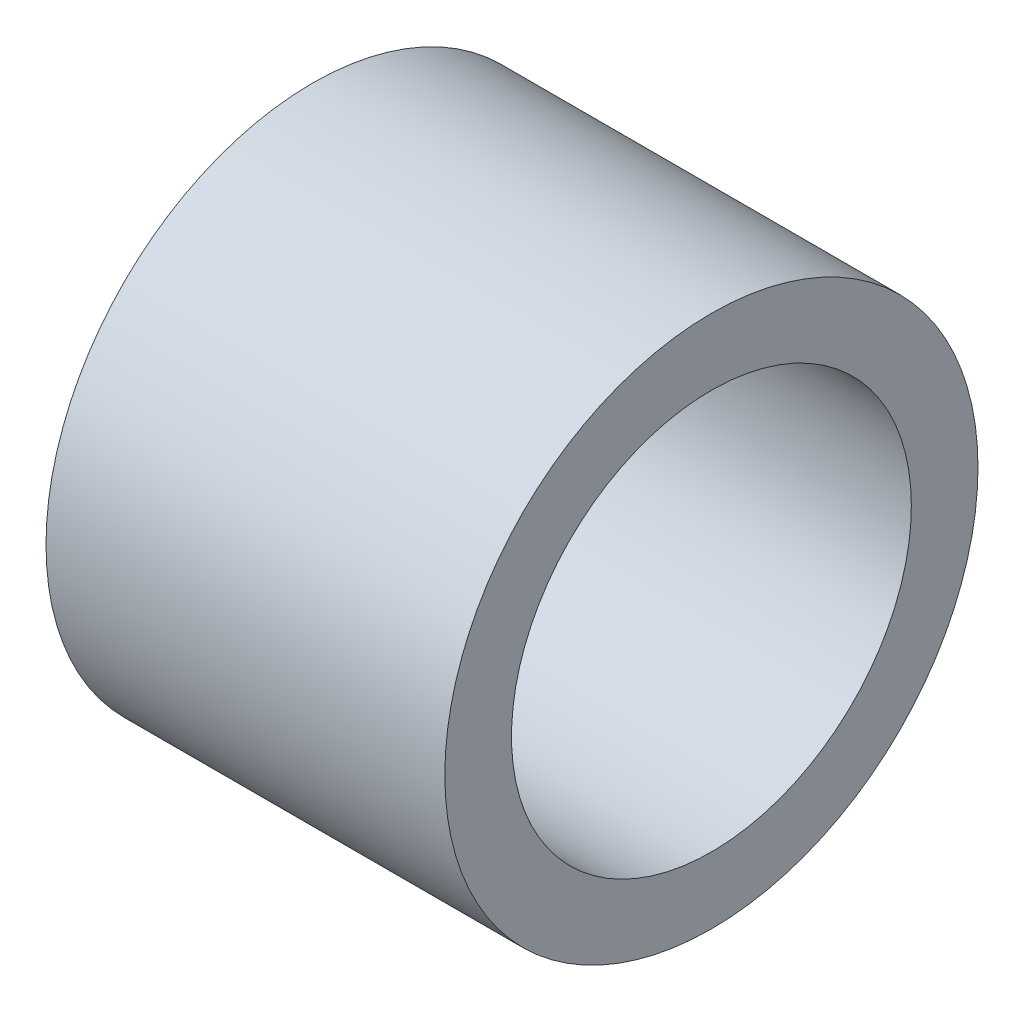
ISO-10303-21;
HEADER;
FILE_DESCRIPTION(('STEP AP214'),'2;1');
FILE_NAME('part.step','',(''),(''),'','','');
FILE_SCHEMA(('AUTOMOTIVE_DESIGN { 1 0 10303 214 1 1 1 1 }'));
ENDSEC;
DATA;
#1=APPLICATION_CONTEXT('core data for automotive mechanical design processes');
#2=APPLICATION_PROTOCOL_DEFINITION('international standard','automotive_design',2000,#1);
#3=PRODUCT_CONTEXT('',#1,'mechanical');
#4=PRODUCT('Part','Part','',(#3));
#5=PRODUCT_RELATED_PRODUCT_CATEGORY('part','',(#4));
#6=PRODUCT_DEFINITION_FORMATION('','',#4);
#7=PRODUCT_DEFINITION_CONTEXT('part definition',#1,'design');
#8=PRODUCT_DEFINITION('design','',#6,#7);
#9=PRODUCT_DEFINITION_SHAPE('','',#8);
#10=(LENGTH_UNIT() NAMED_UNIT(*) SI_UNIT(.MILLI.,.METRE.));
#11=(NAMED_UNIT(*) PLANE_ANGLE_UNIT() SI_UNIT($,.RADIAN.));
#12=(NAMED_UNIT(*) SI_UNIT($,.STERADIAN.) SOLID_ANGLE_UNIT());
#13=UNCERTAINTY_MEASURE_WITH_UNIT(LENGTH_MEASURE(1.E-05),#10,'distance_accuracy_value','');
#14=(GEOMETRIC_REPRESENTATION_CONTEXT(3) GLOBAL_UNCERTAINTY_ASSIGNED_CONTEXT((#13)) GLOBAL_UNIT_ASSIGNED_CONTEXT((#10,
#11,#12)) REPRESENTATION_CONTEXT('',''));
#15=CARTESIAN_POINT('',(0.,0.,0.));
#16=DIRECTION('',(0.,0.,1.));
#17=DIRECTION('',(1.,0.,0.));
#18=AXIS2_PLACEMENT_3D('',#15,#16,#17);
#19=CARTESIAN_POINT('',(9.5,0.,0.));
#20=DIRECTION('',(1.,0.,0.));
#21=DIRECTION('',(0.,0.,-1.));
#22=AXIS2_PLACEMENT_3D('',#19,#20,#21);
#23=PLANE('',#22);
#24=CARTESIAN_POINT('',(9.5,0.,0.));
#25=DIRECTION('',(1.,0.,0.));
#26=DIRECTION('',(0.,0.,-1.));
#27=AXIS2_PLACEMENT_3D('',#24,#25,#26);
#28=CIRCLE('',#27,12.7);
#29=CARTESIAN_POINT('',(9.5,0.,-12.7));
#30=VERTEX_POINT('',#29);
#31=EDGE_CURVE('E10',#30,#30,#28,.T.);
#32=ORIENTED_EDGE('',*,*,#31,.T.);
#33=EDGE_LOOP('',(#32));
#34=FACE_BOUND('',#33,.T.);
#35=CARTESIAN_POINT('',(9.5,0.,0.));
#36=DIRECTION('',(1.,0.,0.));
#37=DIRECTION('',(0.,0.,-1.));
#38=AXIS2_PLACEMENT_3D('',#35,#36,#37);
#39=CIRCLE('',#38,9.525);
#40=CARTESIAN_POINT('',(9.5,0.,-9.525));
#41=VERTEX_POINT('',#40);
#42=EDGE_CURVE('E46',#41,#41,#39,.T.);
#43=ORIENTED_EDGE('',*,*,#42,.F.);
#44=EDGE_LOOP('',(#43));
#45=FACE_BOUND('',#44,.T.);
#46=ADVANCED_FACE('F35',(#34,#45),#23,.T.);
#47=CARTESIAN_POINT('',(-9.5,0.,0.));
#48=DIRECTION('',(1.,0.,0.));
#49=DIRECTION('',(0.,0.,-1.));
#50=AXIS2_PLACEMENT_3D('',#47,#48,#49);
#51=PLANE('',#50);
#52=CARTESIAN_POINT('',(-9.5,0.,0.));
#53=DIRECTION('',(1.,0.,0.));
#54=DIRECTION('',(0.,0.,-1.));
#55=AXIS2_PLACEMENT_3D('',#52,#53,#54);
#56=CIRCLE('',#55,12.7);
#57=CARTESIAN_POINT('',(-9.5,0.,-12.7));
#58=VERTEX_POINT('',#57);
#59=EDGE_CURVE('E39',#58,#58,#56,.T.);
#60=ORIENTED_EDGE('',*,*,#59,.F.);
#61=EDGE_LOOP('',(#60));
#62=FACE_BOUND('',#61,.T.);
#63=CARTESIAN_POINT('',(-9.5,0.,0.));
#64=DIRECTION('',(1.,0.,0.));
#65=DIRECTION('',(0.,0.,-1.));
#66=AXIS2_PLACEMENT_3D('',#63,#64,#65);
#67=CIRCLE('',#66,9.525);
#68=CARTESIAN_POINT('',(-9.5,0.,-9.525));
#69=VERTEX_POINT('',#68);
#70=EDGE_CURVE('E48',#69,#69,#67,.T.);
#71=ORIENTED_EDGE('',*,*,#70,.T.);
#72=EDGE_LOOP('',(#71));
#73=FACE_BOUND('',#72,.T.);
#74=ADVANCED_FACE('F58',(#62,#73),#51,.F.);
#75=CARTESIAN_POINT('',(9.5,0.,0.));
#76=DIRECTION('',(-1.,0.,0.));
#77=DIRECTION('',(0.,0.,1.));
#78=AXIS2_PLACEMENT_3D('',#75,#76,#77);
#79=CYLINDRICAL_SURFACE('',#78,12.7);
#80=ORIENTED_EDGE('',*,*,#31,.F.);
#81=EDGE_LOOP('',(#80));
#82=FACE_BOUND('',#81,.T.);
#83=ORIENTED_EDGE('',*,*,#59,.T.);
#84=EDGE_LOOP('',(#83));
#85=FACE_BOUND('',#84,.T.);
#86=ADVANCED_FACE('F37',(#82,#85),#79,.T.);
#87=CARTESIAN_POINT('',(9.5,0.,0.));
#88=DIRECTION('',(-1.,0.,0.));
#89=DIRECTION('',(0.,0.,1.));
#90=AXIS2_PLACEMENT_3D('',#87,#88,#89);
#91=CYLINDRICAL_SURFACE('',#90,9.525);
#92=ORIENTED_EDGE('',*,*,#42,.T.);
#93=EDGE_LOOP('',(#92));
#94=FACE_BOUND('',#93,.T.);
#95=ORIENTED_EDGE('',*,*,#70,.F.);
#96=EDGE_LOOP('',(#95));
#97=FACE_BOUND('',#96,.T.);
#98=ADVANCED_FACE('F54',(#94,#97),#91,.F.);
#99=CLOSED_SHELL('',(#46,#74,#86,#98));
#100=MANIFOLD_SOLID_BREP('B2',#99);
#101=ADVANCED_BREP_SHAPE_REPRESENTATION('',(#18,#100),#14);
#102=SHAPE_DEFINITION_REPRESENTATION(#9,#101);
ENDSEC;
END-ISO-10303-21;
